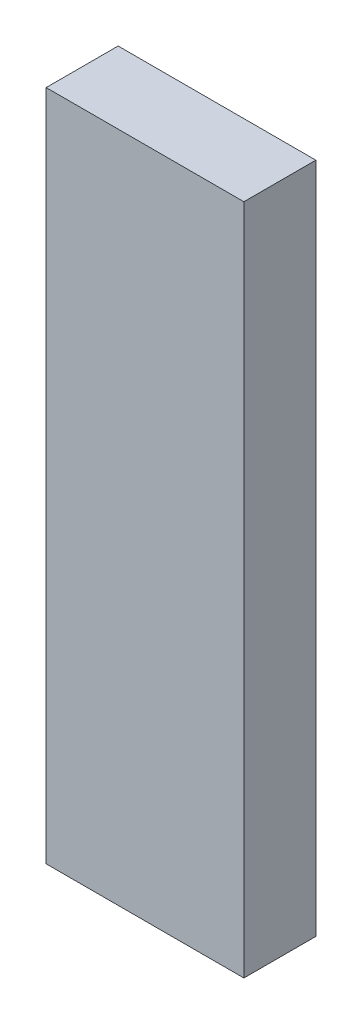
ISO-10303-21;
HEADER;
FILE_DESCRIPTION(('STEP AP214'),'2;1');
FILE_NAME('part.step','',(''),(''),'','','');
FILE_SCHEMA(('AUTOMOTIVE_DESIGN { 1 0 10303 214 1 1 1 1 }'));
ENDSEC;
DATA;
#1=APPLICATION_CONTEXT('core data for automotive mechanical design processes');
#2=APPLICATION_PROTOCOL_DEFINITION('international standard','automotive_design',2000,#1);
#3=PRODUCT_CONTEXT('',#1,'mechanical');
#4=PRODUCT('Part','Part','',(#3));
#5=PRODUCT_RELATED_PRODUCT_CATEGORY('part','',(#4));
#6=PRODUCT_DEFINITION_FORMATION('','',#4);
#7=PRODUCT_DEFINITION_CONTEXT('part definition',#1,'design');
#8=PRODUCT_DEFINITION('design','',#6,#7);
#9=PRODUCT_DEFINITION_SHAPE('','',#8);
#10=(LENGTH_UNIT() NAMED_UNIT(*) SI_UNIT(.MILLI.,.METRE.));
#11=(NAMED_UNIT(*) PLANE_ANGLE_UNIT() SI_UNIT($,.RADIAN.));
#12=(NAMED_UNIT(*) SI_UNIT($,.STERADIAN.) SOLID_ANGLE_UNIT());
#13=UNCERTAINTY_MEASURE_WITH_UNIT(LENGTH_MEASURE(1.E-05),#10,'distance_accuracy_value','');
#14=(GEOMETRIC_REPRESENTATION_CONTEXT(3) GLOBAL_UNCERTAINTY_ASSIGNED_CONTEXT((#13)) GLOBAL_UNIT_ASSIGNED_CONTEXT((#10,
#11,#12)) REPRESENTATION_CONTEXT('',''));
#15=CARTESIAN_POINT('',(0.,0.,0.));
#16=DIRECTION('',(0.,0.,1.));
#17=DIRECTION('',(1.,0.,0.));
#18=AXIS2_PLACEMENT_3D('',#15,#16,#17);
#19=CARTESIAN_POINT('',(2.5,0.,0.));
#20=DIRECTION('',(0.,0.,1.));
#21=DIRECTION('',(1.,0.,0.));
#22=AXIS2_PLACEMENT_3D('',#19,#20,#21);
#23=PLANE('',#22);
#24=DIRECTION('',(0.,1.,0.));
#25=VECTOR('',#24,1.);
#26=CARTESIAN_POINT('',(-2.5,0.,0.));
#27=LINE('',#26,#25);
#28=CARTESIAN_POINT('',(-2.5,0.,0.));
#29=VERTEX_POINT('',#28);
#30=CARTESIAN_POINT('',(-2.5,17.,0.));
#31=VERTEX_POINT('',#30);
#32=EDGE_CURVE('E106',#29,#31,#27,.T.);
#33=ORIENTED_EDGE('',*,*,#32,.T.);
#34=DIRECTION('',(-1.,0.,0.));
#35=VECTOR('',#34,1.);
#36=CARTESIAN_POINT('',(2.5,17.,0.));
#37=LINE('',#36,#35);
#38=CARTESIAN_POINT('',(2.5,17.,0.));
#39=VERTEX_POINT('',#38);
#40=EDGE_CURVE('E11',#39,#31,#37,.T.);
#41=ORIENTED_EDGE('',*,*,#40,.F.);
#42=DIRECTION('',(0.,1.,0.));
#43=VECTOR('',#42,1.);
#44=CARTESIAN_POINT('',(2.5,0.,0.));
#45=LINE('',#44,#43);
#46=CARTESIAN_POINT('',(2.5,0.,0.));
#47=VERTEX_POINT('',#46);
#48=EDGE_CURVE('E94',#47,#39,#45,.T.);
#49=ORIENTED_EDGE('',*,*,#48,.F.);
#50=DIRECTION('',(-1.,0.,0.));
#51=VECTOR('',#50,1.);
#52=CARTESIAN_POINT('',(2.5,0.,0.));
#53=LINE('',#52,#51);
#54=EDGE_CURVE('E102',#47,#29,#53,.T.);
#55=ORIENTED_EDGE('',*,*,#54,.T.);
#56=EDGE_LOOP('',(#33,#41,#49,#55));
#57=FACE_BOUND('',#56,.T.);
#58=ADVANCED_FACE('F43',(#57),#23,.F.);
#59=CARTESIAN_POINT('',(2.5,17.,0.));
#60=DIRECTION('',(0.,-1.,0.));
#61=DIRECTION('',(0.,0.,-1.));
#62=AXIS2_PLACEMENT_3D('',#59,#60,#61);
#63=PLANE('',#62);
#64=DIRECTION('',(0.,0.,1.));
#65=VECTOR('',#64,1.);
#66=CARTESIAN_POINT('',(-2.5,17.,0.));
#67=LINE('',#66,#65);
#68=CARTESIAN_POINT('',(-2.5,17.,1.82));
#69=VERTEX_POINT('',#68);
#70=EDGE_CURVE('E98',#31,#69,#67,.T.);
#71=ORIENTED_EDGE('',*,*,#70,.T.);
#72=DIRECTION('',(-1.,0.,0.));
#73=VECTOR('',#72,1.);
#74=CARTESIAN_POINT('',(2.5,17.,1.82));
#75=LINE('',#74,#73);
#76=CARTESIAN_POINT('',(2.5,17.,1.82));
#77=VERTEX_POINT('',#76);
#78=EDGE_CURVE('E51',#77,#69,#75,.T.);
#79=ORIENTED_EDGE('',*,*,#78,.F.);
#80=DIRECTION('',(0.,0.,1.));
#81=VECTOR('',#80,1.);
#82=CARTESIAN_POINT('',(2.5,17.,0.));
#83=LINE('',#82,#81);
#84=EDGE_CURVE('E89',#39,#77,#83,.T.);
#85=ORIENTED_EDGE('',*,*,#84,.F.);
#86=ORIENTED_EDGE('',*,*,#40,.T.);
#87=EDGE_LOOP('',(#71,#79,#85,#86));
#88=FACE_BOUND('',#87,.T.);
#89=ADVANCED_FACE('F97',(#88),#63,.F.);
#90=CARTESIAN_POINT('',(2.5,0.,1.82));
#91=DIRECTION('',(0.,0.,-1.));
#92=DIRECTION('',(-1.,0.,0.));
#93=AXIS2_PLACEMENT_3D('',#90,#91,#92);
#94=PLANE('',#93);
#95=DIRECTION('',(0.,-1.,0.));
#96=VECTOR('',#95,1.);
#97=CARTESIAN_POINT('',(-2.5,0.,1.82));
#98=LINE('',#97,#96);
#99=CARTESIAN_POINT('',(-2.5,0.,1.82));
#100=VERTEX_POINT('',#99);
#101=EDGE_CURVE('E76',#69,#100,#98,.T.);
#102=ORIENTED_EDGE('',*,*,#101,.T.);
#103=DIRECTION('',(-1.,0.,0.));
#104=VECTOR('',#103,1.);
#105=CARTESIAN_POINT('',(2.5,0.,1.82));
#106=LINE('',#105,#104);
#107=CARTESIAN_POINT('',(2.5,0.,1.82));
#108=VERTEX_POINT('',#107);
#109=EDGE_CURVE('E99',#108,#100,#106,.T.);
#110=ORIENTED_EDGE('',*,*,#109,.F.);
#111=DIRECTION('',(0.,-1.,0.));
#112=VECTOR('',#111,1.);
#113=CARTESIAN_POINT('',(2.5,0.,1.82));
#114=LINE('',#113,#112);
#115=EDGE_CURVE('E92',#77,#108,#114,.T.);
#116=ORIENTED_EDGE('',*,*,#115,.F.);
#117=ORIENTED_EDGE('',*,*,#78,.T.);
#118=EDGE_LOOP('',(#102,#110,#116,#117));
#119=FACE_BOUND('',#118,.T.);
#120=ADVANCED_FACE('F100',(#119),#94,.F.);
#121=CARTESIAN_POINT('',(2.5,0.,0.));
#122=DIRECTION('',(0.,1.,0.));
#123=DIRECTION('',(0.,0.,1.));
#124=AXIS2_PLACEMENT_3D('',#121,#122,#123);
#125=PLANE('',#124);
#126=DIRECTION('',(0.,0.,-1.));
#127=VECTOR('',#126,1.);
#128=CARTESIAN_POINT('',(-2.5,0.,0.));
#129=LINE('',#128,#127);
#130=EDGE_CURVE('E82',#100,#29,#129,.T.);
#131=ORIENTED_EDGE('',*,*,#130,.T.);
#132=ORIENTED_EDGE('',*,*,#54,.F.);
#133=DIRECTION('',(0.,0.,-1.));
#134=VECTOR('',#133,1.);
#135=CARTESIAN_POINT('',(2.5,0.,0.));
#136=LINE('',#135,#134);
#137=EDGE_CURVE('E59',#108,#47,#136,.T.);
#138=ORIENTED_EDGE('',*,*,#137,.F.);
#139=ORIENTED_EDGE('',*,*,#109,.T.);
#140=EDGE_LOOP('',(#131,#132,#138,#139));
#141=FACE_BOUND('',#140,.T.);
#142=ADVANCED_FACE('F113',(#141),#125,.F.);
#143=CARTESIAN_POINT('',(2.5,0.,0.));
#144=DIRECTION('',(1.,0.,0.));
#145=DIRECTION('',(0.,0.,-1.));
#146=AXIS2_PLACEMENT_3D('',#143,#144,#145);
#147=PLANE('',#146);
#148=ORIENTED_EDGE('',*,*,#48,.T.);
#149=ORIENTED_EDGE('',*,*,#84,.T.);
#150=ORIENTED_EDGE('',*,*,#115,.T.);
#151=ORIENTED_EDGE('',*,*,#137,.T.);
#152=EDGE_LOOP('',(#148,#149,#150,#151));
#153=FACE_BOUND('',#152,.T.);
#154=ADVANCED_FACE('F90',(#153),#147,.T.);
#155=CARTESIAN_POINT('',(-2.5,0.,0.));
#156=DIRECTION('',(1.,0.,0.));
#157=DIRECTION('',(0.,0.,-1.));
#158=AXIS2_PLACEMENT_3D('',#155,#156,#157);
#159=PLANE('',#158);
#160=ORIENTED_EDGE('',*,*,#32,.F.);
#161=ORIENTED_EDGE('',*,*,#130,.F.);
#162=ORIENTED_EDGE('',*,*,#101,.F.);
#163=ORIENTED_EDGE('',*,*,#70,.F.);
#164=EDGE_LOOP('',(#160,#161,#162,#163));
#165=FACE_BOUND('',#164,.T.);
#166=ADVANCED_FACE('F116',(#165),#159,.F.);
#167=CLOSED_SHELL('',(#58,#89,#120,#142,#154,#166));
#168=MANIFOLD_SOLID_BREP('B2',#167);
#169=ADVANCED_BREP_SHAPE_REPRESENTATION('',(#18,#168),#14);
#170=SHAPE_DEFINITION_REPRESENTATION(#9,#169);
ENDSEC;
END-ISO-10303-21;
